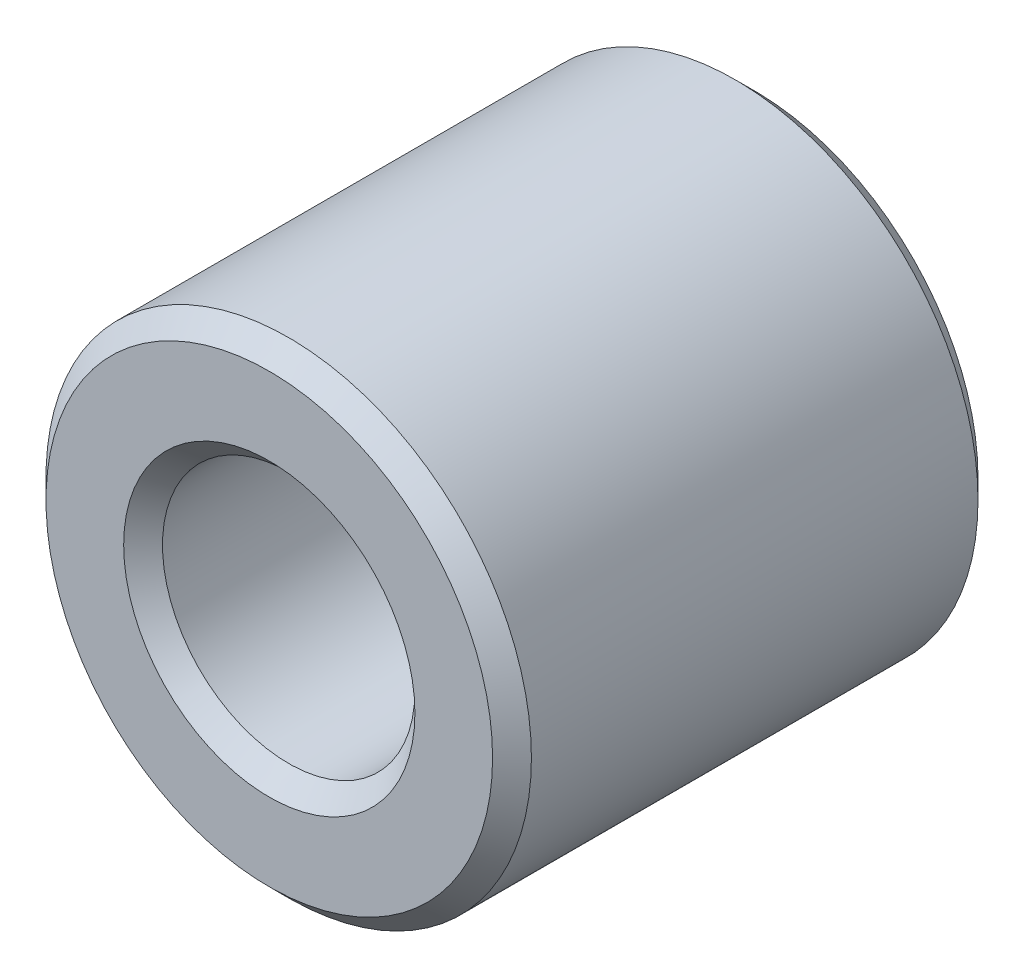
ISO-10303-21;
HEADER;
FILE_DESCRIPTION(('STEP AP214'),'2;1');
FILE_NAME('part.step','',(''),(''),'','','');
FILE_SCHEMA(('AUTOMOTIVE_DESIGN { 1 0 10303 214 1 1 1 1 }'));
ENDSEC;
DATA;
#1=APPLICATION_CONTEXT('core data for automotive mechanical design processes');
#2=APPLICATION_PROTOCOL_DEFINITION('international standard','automotive_design',2000,#1);
#3=PRODUCT_CONTEXT('',#1,'mechanical');
#4=PRODUCT('Part','Part','',(#3));
#5=PRODUCT_RELATED_PRODUCT_CATEGORY('part','',(#4));
#6=PRODUCT_DEFINITION_FORMATION('','',#4);
#7=PRODUCT_DEFINITION_CONTEXT('part definition',#1,'design');
#8=PRODUCT_DEFINITION('design','',#6,#7);
#9=PRODUCT_DEFINITION_SHAPE('','',#8);
#10=(LENGTH_UNIT() NAMED_UNIT(*) SI_UNIT(.MILLI.,.METRE.));
#11=(NAMED_UNIT(*) PLANE_ANGLE_UNIT() SI_UNIT($,.RADIAN.));
#12=(NAMED_UNIT(*) SI_UNIT($,.STERADIAN.) SOLID_ANGLE_UNIT());
#13=UNCERTAINTY_MEASURE_WITH_UNIT(LENGTH_MEASURE(1.E-05),#10,'distance_accuracy_value','');
#14=(GEOMETRIC_REPRESENTATION_CONTEXT(3) GLOBAL_UNCERTAINTY_ASSIGNED_CONTEXT((#13)) GLOBAL_UNIT_ASSIGNED_CONTEXT((#10,
#11,#12)) REPRESENTATION_CONTEXT('',''));
#15=CARTESIAN_POINT('',(0.,0.,0.));
#16=DIRECTION('',(0.,0.,1.));
#17=DIRECTION('',(1.,0.,0.));
#18=AXIS2_PLACEMENT_3D('',#15,#16,#17);
#19=CARTESIAN_POINT('',(0.,0.,6.35));
#20=DIRECTION('',(0.,0.,1.));
#21=DIRECTION('',(1.,0.,0.));
#22=AXIS2_PLACEMENT_3D('',#19,#20,#21);
#23=PLANE('',#22);
#24=CARTESIAN_POINT('',(0.,0.,6.35));
#25=DIRECTION('',(0.,0.,1.));
#26=DIRECTION('',(1.,0.,0.));
#27=AXIS2_PLACEMENT_3D('',#24,#25,#26);
#28=CIRCLE('',#27,2.921);
#29=CARTESIAN_POINT('',(2.921,0.,6.35));
#30=VERTEX_POINT('',#29);
#31=EDGE_CURVE('E10',#30,#30,#28,.T.);
#32=ORIENTED_EDGE('',*,*,#31,.T.);
#33=EDGE_LOOP('',(#32));
#34=FACE_BOUND('',#33,.T.);
#35=CARTESIAN_POINT('',(0.,0.,6.35));
#36=DIRECTION('',(0.,0.,1.));
#37=DIRECTION('',(1.,0.,0.));
#38=AXIS2_PLACEMENT_3D('',#35,#36,#37);
#39=CIRCLE('',#38,1.905);
#40=CARTESIAN_POINT('',(1.905,0.,6.35));
#41=VERTEX_POINT('',#40);
#42=EDGE_CURVE('E51',#41,#41,#39,.F.);
#43=ORIENTED_EDGE('',*,*,#42,.T.);
#44=EDGE_LOOP('',(#43));
#45=FACE_BOUND('',#44,.T.);
#46=ADVANCED_FACE('F43',(#34,#45),#23,.T.);
#47=CARTESIAN_POINT('',(0.,0.,0.));
#48=DIRECTION('',(0.,0.,1.));
#49=DIRECTION('',(1.,0.,0.));
#50=AXIS2_PLACEMENT_3D('',#47,#48,#49);
#51=PLANE('',#50);
#52=CARTESIAN_POINT('',(0.,0.,0.));
#53=DIRECTION('',(0.,0.,1.));
#54=DIRECTION('',(1.,0.,0.));
#55=AXIS2_PLACEMENT_3D('',#52,#53,#54);
#56=CIRCLE('',#55,2.921);
#57=CARTESIAN_POINT('',(2.921,0.,0.));
#58=VERTEX_POINT('',#57);
#59=EDGE_CURVE('E64',#58,#58,#56,.F.);
#60=ORIENTED_EDGE('',*,*,#59,.T.);
#61=EDGE_LOOP('',(#60));
#62=FACE_BOUND('',#61,.T.);
#63=CARTESIAN_POINT('',(0.,0.,0.));
#64=DIRECTION('',(0.,0.,1.));
#65=DIRECTION('',(1.,0.,0.));
#66=AXIS2_PLACEMENT_3D('',#63,#64,#65);
#67=CIRCLE('',#66,1.905);
#68=CARTESIAN_POINT('',(1.905,0.,0.));
#69=VERTEX_POINT('',#68);
#70=EDGE_CURVE('E67',#69,#69,#67,.T.);
#71=ORIENTED_EDGE('',*,*,#70,.T.);
#72=EDGE_LOOP('',(#71));
#73=FACE_BOUND('',#72,.T.);
#74=ADVANCED_FACE('F93',(#62,#73),#51,.F.);
#75=CARTESIAN_POINT('',(0.,0.,6.35));
#76=DIRECTION('',(0.,0.,-1.));
#77=DIRECTION('',(-1.,0.,0.));
#78=AXIS2_PLACEMENT_3D('',#75,#76,#77);
#79=CYLINDRICAL_SURFACE('',#78,3.175);
#80=CARTESIAN_POINT('',(0.,0.,0.253999999999998));
#81=DIRECTION('',(0.,0.,1.));
#82=DIRECTION('',(1.,0.,0.));
#83=AXIS2_PLACEMENT_3D('',#80,#81,#82);
#84=CIRCLE('',#83,3.175);
#85=CARTESIAN_POINT('',(3.175,0.,0.253999999999998));
#86=VERTEX_POINT('',#85);
#87=EDGE_CURVE('E70',#86,#86,#84,.T.);
#88=ORIENTED_EDGE('',*,*,#87,.T.);
#89=EDGE_LOOP('',(#88));
#90=FACE_BOUND('',#89,.T.);
#91=CARTESIAN_POINT('',(0.,0.,6.096));
#92=DIRECTION('',(0.,0.,1.));
#93=DIRECTION('',(1.,0.,0.));
#94=AXIS2_PLACEMENT_3D('',#91,#92,#93);
#95=CIRCLE('',#94,3.175);
#96=CARTESIAN_POINT('',(3.175,0.,6.096));
#97=VERTEX_POINT('',#96);
#98=EDGE_CURVE('E73',#97,#97,#95,.F.);
#99=ORIENTED_EDGE('',*,*,#98,.T.);
#100=EDGE_LOOP('',(#99));
#101=FACE_BOUND('',#100,.T.);
#102=ADVANCED_FACE('F77',(#90,#101),#79,.T.);
#103=CARTESIAN_POINT('',(0.,0.,6.35));
#104=DIRECTION('',(0.,0.,-1.));
#105=DIRECTION('',(-1.,0.,0.));
#106=AXIS2_PLACEMENT_3D('',#103,#104,#105);
#107=CYLINDRICAL_SURFACE('',#106,1.651);
#108=CARTESIAN_POINT('',(0.,0.,0.254000000000002));
#109=DIRECTION('',(0.,0.,1.));
#110=DIRECTION('',(1.,0.,0.));
#111=AXIS2_PLACEMENT_3D('',#108,#109,#110);
#112=CIRCLE('',#111,1.651);
#113=CARTESIAN_POINT('',(1.651,0.,0.254000000000002));
#114=VERTEX_POINT('',#113);
#115=EDGE_CURVE('E55',#114,#114,#112,.F.);
#116=ORIENTED_EDGE('',*,*,#115,.T.);
#117=EDGE_LOOP('',(#116));
#118=FACE_BOUND('',#117,.T.);
#119=CARTESIAN_POINT('',(0.,0.,6.096));
#120=DIRECTION('',(0.,0.,1.));
#121=DIRECTION('',(1.,0.,0.));
#122=AXIS2_PLACEMENT_3D('',#119,#120,#121);
#123=CIRCLE('',#122,1.651);
#124=CARTESIAN_POINT('',(1.651,0.,6.096));
#125=VERTEX_POINT('',#124);
#126=EDGE_CURVE('E59',#125,#125,#123,.T.);
#127=ORIENTED_EDGE('',*,*,#126,.T.);
#128=EDGE_LOOP('',(#127));
#129=FACE_BOUND('',#128,.T.);
#130=ADVANCED_FACE('F101',(#118,#129),#107,.F.);
#131=CARTESIAN_POINT('',(0.,0.,0.253999999999998));
#132=DIRECTION('',(0.,0.,1.));
#133=DIRECTION('',(1.,0.,0.));
#134=AXIS2_PLACEMENT_3D('',#131,#132,#133);
#135=CONICAL_SURFACE('',#134,3.175,0.785398163397449);
#136=ORIENTED_EDGE('',*,*,#59,.F.);
#137=EDGE_LOOP('',(#136));
#138=FACE_BOUND('',#137,.T.);
#139=ORIENTED_EDGE('',*,*,#87,.F.);
#140=EDGE_LOOP('',(#139));
#141=FACE_BOUND('',#140,.T.);
#142=ADVANCED_FACE('F88',(#138,#141),#135,.T.);
#143=CARTESIAN_POINT('',(0.,0.,0.));
#144=DIRECTION('',(0.,0.,-1.));
#145=DIRECTION('',(-1.,0.,0.));
#146=AXIS2_PLACEMENT_3D('',#143,#144,#145);
#147=CONICAL_SURFACE('',#146,1.905,0.785398163397446);
#148=ORIENTED_EDGE('',*,*,#115,.F.);
#149=EDGE_LOOP('',(#148));
#150=FACE_BOUND('',#149,.T.);
#151=ORIENTED_EDGE('',*,*,#70,.F.);
#152=EDGE_LOOP('',(#151));
#153=FACE_BOUND('',#152,.T.);
#154=ADVANCED_FACE('F82',(#150,#153),#147,.F.);
#155=CARTESIAN_POINT('',(0.,0.,6.35));
#156=DIRECTION('',(0.,0.,-1.));
#157=DIRECTION('',(-1.,0.,0.));
#158=AXIS2_PLACEMENT_3D('',#155,#156,#157);
#159=CONICAL_SURFACE('',#158,2.921,0.785398163397447);
#160=ORIENTED_EDGE('',*,*,#98,.F.);
#161=EDGE_LOOP('',(#160));
#162=FACE_BOUND('',#161,.T.);
#163=ORIENTED_EDGE('',*,*,#31,.F.);
#164=EDGE_LOOP('',(#163));
#165=FACE_BOUND('',#164,.T.);
#166=ADVANCED_FACE('F79',(#162,#165),#159,.T.);
#167=CARTESIAN_POINT('',(0.,0.,6.096));
#168=DIRECTION('',(0.,0.,1.));
#169=DIRECTION('',(1.,0.,0.));
#170=AXIS2_PLACEMENT_3D('',#167,#168,#169);
#171=CONICAL_SURFACE('',#170,1.651,0.785398163397453);
#172=ORIENTED_EDGE('',*,*,#42,.F.);
#173=EDGE_LOOP('',(#172));
#174=FACE_BOUND('',#173,.T.);
#175=ORIENTED_EDGE('',*,*,#126,.F.);
#176=EDGE_LOOP('',(#175));
#177=FACE_BOUND('',#176,.T.);
#178=ADVANCED_FACE('F46',(#174,#177),#171,.F.);
#179=CLOSED_SHELL('',(#46,#74,#102,#130,#142,#154,#166,#178));
#180=MANIFOLD_SOLID_BREP('B2',#179);
#181=ADVANCED_BREP_SHAPE_REPRESENTATION('',(#18,#180),#14);
#182=SHAPE_DEFINITION_REPRESENTATION(#9,#181);
ENDSEC;
END-ISO-10303-21;
